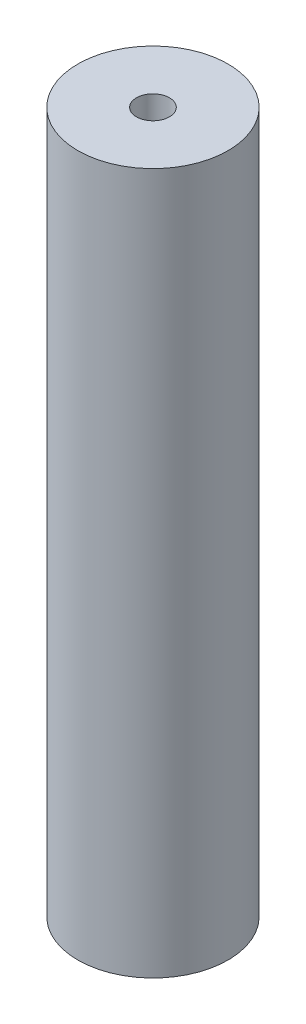
ISO-10303-21;
HEADER;
FILE_DESCRIPTION(('STEP AP214'),'2;1');
FILE_NAME('part.step','',(''),(''),'','','');
FILE_SCHEMA(('AUTOMOTIVE_DESIGN { 1 0 10303 214 1 1 1 1 }'));
ENDSEC;
DATA;
#1=APPLICATION_CONTEXT('core data for automotive mechanical design processes');
#2=APPLICATION_PROTOCOL_DEFINITION('international standard','automotive_design',2000,#1);
#3=PRODUCT_CONTEXT('',#1,'mechanical');
#4=PRODUCT('Part','Part','',(#3));
#5=PRODUCT_RELATED_PRODUCT_CATEGORY('part','',(#4));
#6=PRODUCT_DEFINITION_FORMATION('','',#4);
#7=PRODUCT_DEFINITION_CONTEXT('part definition',#1,'design');
#8=PRODUCT_DEFINITION('design','',#6,#7);
#9=PRODUCT_DEFINITION_SHAPE('','',#8);
#10=(LENGTH_UNIT() NAMED_UNIT(*) SI_UNIT(.MILLI.,.METRE.));
#11=(NAMED_UNIT(*) PLANE_ANGLE_UNIT() SI_UNIT($,.RADIAN.));
#12=(NAMED_UNIT(*) SI_UNIT($,.STERADIAN.) SOLID_ANGLE_UNIT());
#13=UNCERTAINTY_MEASURE_WITH_UNIT(LENGTH_MEASURE(1.E-05),#10,'distance_accuracy_value','');
#14=(GEOMETRIC_REPRESENTATION_CONTEXT(3) GLOBAL_UNCERTAINTY_ASSIGNED_CONTEXT((#13)) GLOBAL_UNIT_ASSIGNED_CONTEXT((#10,
#11,#12)) REPRESENTATION_CONTEXT('',''));
#15=CARTESIAN_POINT('',(0.,0.,0.));
#16=DIRECTION('',(0.,0.,1.));
#17=DIRECTION('',(1.,0.,0.));
#18=AXIS2_PLACEMENT_3D('',#15,#16,#17);
#19=CARTESIAN_POINT('',(0.,70.,0.));
#20=DIRECTION('',(0.,-1.,0.));
#21=DIRECTION('',(0.,0.,-1.));
#22=AXIS2_PLACEMENT_3D('',#19,#20,#21);
#23=CYLINDRICAL_SURFACE('',#22,7.49999999999999);
#24=CARTESIAN_POINT('',(0.,70.,0.));
#25=DIRECTION('',(0.,1.,0.));
#26=DIRECTION('',(0.,0.,1.));
#27=AXIS2_PLACEMENT_3D('',#24,#25,#26);
#28=CIRCLE('',#27,7.49999999999999);
#29=CARTESIAN_POINT('',(0.,70.,7.49999999999999));
#30=VERTEX_POINT('',#29);
#31=EDGE_CURVE('E11',#30,#30,#28,.T.);
#32=ORIENTED_EDGE('',*,*,#31,.F.);
#33=EDGE_LOOP('',(#32));
#34=FACE_BOUND('',#33,.T.);
#35=CARTESIAN_POINT('',(0.,0.,0.));
#36=DIRECTION('',(0.,1.,0.));
#37=DIRECTION('',(0.,0.,1.));
#38=AXIS2_PLACEMENT_3D('',#35,#36,#37);
#39=CIRCLE('',#38,7.49999999999999);
#40=CARTESIAN_POINT('',(0.,0.,7.49999999999999));
#41=VERTEX_POINT('',#40);
#42=EDGE_CURVE('E38',#41,#41,#39,.T.);
#43=ORIENTED_EDGE('',*,*,#42,.T.);
#44=EDGE_LOOP('',(#43));
#45=FACE_BOUND('',#44,.T.);
#46=ADVANCED_FACE('F35',(#34,#45),#23,.T.);
#47=CARTESIAN_POINT('',(0.,70.,0.));
#48=DIRECTION('',(0.,1.,0.));
#49=DIRECTION('',(0.,0.,1.));
#50=AXIS2_PLACEMENT_3D('',#47,#48,#49);
#51=PLANE('',#50);
#52=CARTESIAN_POINT('',(0.,70.,0.));
#53=DIRECTION('',(0.,1.,0.));
#54=DIRECTION('',(0.,0.,1.));
#55=AXIS2_PLACEMENT_3D('',#52,#53,#54);
#56=CIRCLE('',#55,1.64999999999999);
#57=CARTESIAN_POINT('',(0.,70.,1.64999999999999));
#58=VERTEX_POINT('',#57);
#59=EDGE_CURVE('E58',#58,#58,#56,.T.);
#60=ORIENTED_EDGE('',*,*,#59,.F.);
#61=EDGE_LOOP('',(#60));
#62=FACE_BOUND('',#61,.T.);
#63=ORIENTED_EDGE('',*,*,#31,.T.);
#64=EDGE_LOOP('',(#63));
#65=FACE_BOUND('',#64,.T.);
#66=ADVANCED_FACE('F77',(#62,#65),#51,.T.);
#67=CARTESIAN_POINT('',(0.,0.,0.));
#68=DIRECTION('',(0.,1.,0.));
#69=DIRECTION('',(0.,0.,1.));
#70=AXIS2_PLACEMENT_3D('',#67,#68,#69);
#71=PLANE('',#70);
#72=CARTESIAN_POINT('',(0.,0.,0.));
#73=DIRECTION('',(0.,-1.,0.));
#74=DIRECTION('',(0.,0.,-1.));
#75=AXIS2_PLACEMENT_3D('',#72,#73,#74);
#76=CIRCLE('',#75,1.64999999999999);
#77=CARTESIAN_POINT('',(0.,0.,-1.64999999999999));
#78=VERTEX_POINT('',#77);
#79=EDGE_CURVE('E59',#78,#78,#76,.T.);
#80=ORIENTED_EDGE('',*,*,#79,.F.);
#81=EDGE_LOOP('',(#80));
#82=FACE_BOUND('',#81,.T.);
#83=ORIENTED_EDGE('',*,*,#42,.F.);
#84=EDGE_LOOP('',(#83));
#85=FACE_BOUND('',#84,.T.);
#86=ADVANCED_FACE('F74',(#82,#85),#71,.F.);
#87=CARTESIAN_POINT('',(0.,50.,0.));
#88=DIRECTION('',(0.,1.,0.));
#89=DIRECTION('',(0.,0.,1.));
#90=AXIS2_PLACEMENT_3D('',#87,#88,#89);
#91=CONICAL_SURFACE('',#90,1.65,1.02974425867665);
#92=CARTESIAN_POINT('',(0.,49.0085799786045,0.));
#93=VERTEX_POINT('',#92);
#94=VERTEX_LOOP('',#93);
#95=FACE_BOUND('',#94,.T.);
#96=CARTESIAN_POINT('',(0.,50.,0.));
#97=DIRECTION('',(0.,1.,0.));
#98=DIRECTION('',(0.,0.,1.));
#99=AXIS2_PLACEMENT_3D('',#96,#97,#98);
#100=CIRCLE('',#99,1.65);
#101=CARTESIAN_POINT('',(0.,50.,1.65));
#102=VERTEX_POINT('',#101);
#103=EDGE_CURVE('E62',#102,#102,#100,.T.);
#104=ORIENTED_EDGE('',*,*,#103,.T.);
#105=EDGE_LOOP('',(#104));
#106=FACE_BOUND('',#105,.T.);
#107=ADVANCED_FACE('F76',(#95,#106),#91,.F.);
#108=CARTESIAN_POINT('',(0.,70.,0.));
#109=DIRECTION('',(0.,1.,0.));
#110=DIRECTION('',(0.,0.,1.));
#111=AXIS2_PLACEMENT_3D('',#108,#109,#110);
#112=CYLINDRICAL_SURFACE('',#111,1.64999999999999);
#113=ORIENTED_EDGE('',*,*,#103,.F.);
#114=EDGE_LOOP('',(#113));
#115=FACE_BOUND('',#114,.T.);
#116=ORIENTED_EDGE('',*,*,#59,.T.);
#117=EDGE_LOOP('',(#116));
#118=FACE_BOUND('',#117,.T.);
#119=ADVANCED_FACE('F52',(#115,#118),#112,.F.);
#120=CARTESIAN_POINT('',(0.,20.,0.));
#121=DIRECTION('',(0.,-1.,0.));
#122=DIRECTION('',(0.,0.,-1.));
#123=AXIS2_PLACEMENT_3D('',#120,#121,#122);
#124=CONICAL_SURFACE('',#123,1.65,1.02974425867665);
#125=CARTESIAN_POINT('',(0.,20.9914200213955,0.));
#126=VERTEX_POINT('',#125);
#127=VERTEX_LOOP('',#126);
#128=FACE_BOUND('',#127,.T.);
#129=CARTESIAN_POINT('',(0.,20.,0.));
#130=DIRECTION('',(0.,-1.,0.));
#131=DIRECTION('',(0.,0.,-1.));
#132=AXIS2_PLACEMENT_3D('',#129,#130,#131);
#133=CIRCLE('',#132,1.65);
#134=CARTESIAN_POINT('',(0.,20.,-1.65));
#135=VERTEX_POINT('',#134);
#136=EDGE_CURVE('E56',#135,#135,#133,.T.);
#137=ORIENTED_EDGE('',*,*,#136,.T.);
#138=EDGE_LOOP('',(#137));
#139=FACE_BOUND('',#138,.T.);
#140=ADVANCED_FACE('F48',(#128,#139),#124,.F.);
#141=CARTESIAN_POINT('',(0.,0.,0.));
#142=DIRECTION('',(0.,-1.,0.));
#143=DIRECTION('',(0.,0.,-1.));
#144=AXIS2_PLACEMENT_3D('',#141,#142,#143);
#145=CYLINDRICAL_SURFACE('',#144,1.64999999999999);
#146=ORIENTED_EDGE('',*,*,#136,.F.);
#147=EDGE_LOOP('',(#146));
#148=FACE_BOUND('',#147,.T.);
#149=ORIENTED_EDGE('',*,*,#79,.T.);
#150=EDGE_LOOP('',(#149));
#151=FACE_BOUND('',#150,.T.);
#152=ADVANCED_FACE('F51',(#148,#151),#145,.F.);
#153=CLOSED_SHELL('',(#46,#66,#86,#107,#119,#140,#152));
#154=MANIFOLD_SOLID_BREP('B2',#153);
#155=ADVANCED_BREP_SHAPE_REPRESENTATION('',(#18,#154),#14);
#156=SHAPE_DEFINITION_REPRESENTATION(#9,#155);
ENDSEC;
END-ISO-10303-21;
